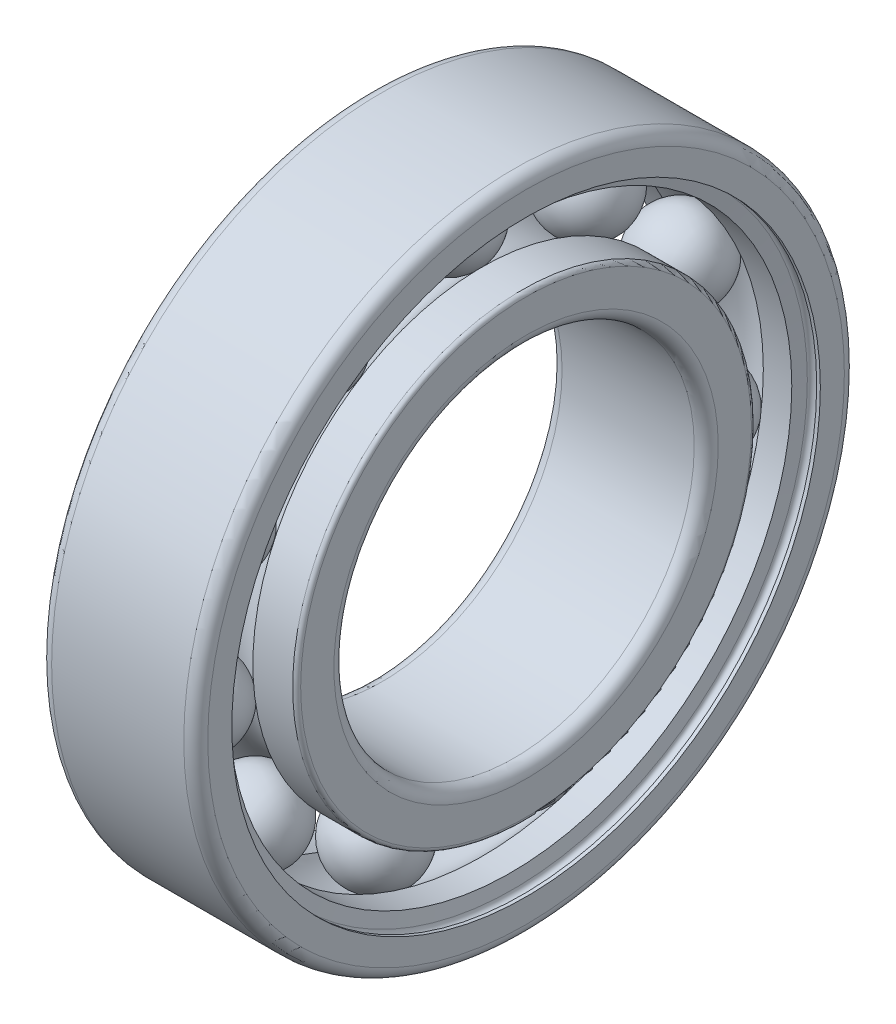
ISO-10303-21;
HEADER;
FILE_DESCRIPTION(('STEP AP214'),'2;1');
FILE_NAME('part.step','',(''),(''),'','','');
FILE_SCHEMA(('AUTOMOTIVE_DESIGN { 1 0 10303 214 1 1 1 1 }'));
ENDSEC;
DATA;
#1=APPLICATION_CONTEXT('core data for automotive mechanical design processes');
#2=APPLICATION_PROTOCOL_DEFINITION('international standard','automotive_design',2000,#1);
#3=PRODUCT_CONTEXT('',#1,'mechanical');
#4=PRODUCT('Part','Part','',(#3));
#5=PRODUCT_RELATED_PRODUCT_CATEGORY('part','',(#4));
#6=PRODUCT_DEFINITION_FORMATION('','',#4);
#7=PRODUCT_DEFINITION_CONTEXT('part definition',#1,'design');
#8=PRODUCT_DEFINITION('design','',#6,#7);
#9=PRODUCT_DEFINITION_SHAPE('','',#8);
#10=(LENGTH_UNIT() NAMED_UNIT(*) SI_UNIT(.MILLI.,.METRE.));
#11=(NAMED_UNIT(*) PLANE_ANGLE_UNIT() SI_UNIT($,.RADIAN.));
#12=(NAMED_UNIT(*) SI_UNIT($,.STERADIAN.) SOLID_ANGLE_UNIT());
#13=UNCERTAINTY_MEASURE_WITH_UNIT(LENGTH_MEASURE(1.E-05),#10,'distance_accuracy_value','');
#14=(GEOMETRIC_REPRESENTATION_CONTEXT(3) GLOBAL_UNCERTAINTY_ASSIGNED_CONTEXT((#13)) GLOBAL_UNIT_ASSIGNED_CONTEXT((#10,
#11,#12)) REPRESENTATION_CONTEXT('',''));
#15=CARTESIAN_POINT('',(0.,0.,0.));
#16=DIRECTION('',(0.,0.,1.));
#17=DIRECTION('',(1.,0.,0.));
#18=AXIS2_PLACEMENT_3D('',#15,#16,#17);
#19=CARTESIAN_POINT('',(0.999999999999225,0.,0.));
#20=DIRECTION('',(1.,0.,0.));
#21=DIRECTION('',(0.,0.,-1.));
#22=AXIS2_PLACEMENT_3D('',#19,#20,#21);
#23=TOROIDAL_SURFACE('',#22,15.9999999999992,0.999999999999224);
#24=CARTESIAN_POINT('',(1.,0.,0.));
#25=DIRECTION('',(1.,0.,0.));
#26=DIRECTION('',(0.,0.,-1.));
#27=AXIS2_PLACEMENT_3D('',#24,#25,#26);
#28=CIRCLE('',#27,15.);
#29=CARTESIAN_POINT('',(1.,0.,-15.));
#30=VERTEX_POINT('',#29);
#31=EDGE_CURVE('P0_E10',#30,#30,#28,.T.);
#32=ORIENTED_EDGE('',*,*,#31,.T.);
#33=EDGE_LOOP('',(#32));
#34=FACE_BOUND('',#33,.T.);
#35=CARTESIAN_POINT('',(0.,0.,0.));
#36=DIRECTION('',(1.,0.,0.));
#37=DIRECTION('',(0.,0.,-1.));
#38=AXIS2_PLACEMENT_3D('',#35,#36,#37);
#39=CIRCLE('',#38,16.);
#40=CARTESIAN_POINT('',(0.,0.,-16.));
#41=VERTEX_POINT('',#40);
#42=EDGE_CURVE('P0_E49',#41,#41,#39,.T.);
#43=ORIENTED_EDGE('',*,*,#42,.F.);
#44=EDGE_LOOP('',(#43));
#45=FACE_BOUND('',#44,.T.);
#46=ADVANCED_FACE('P0_F15',(#34,#45),#23,.T.);
#47=CARTESIAN_POINT('',(12.,0.,0.));
#48=DIRECTION('',(1.,0.,0.));
#49=DIRECTION('',(0.,0.,-1.));
#50=AXIS2_PLACEMENT_3D('',#47,#48,#49);
#51=CYLINDRICAL_SURFACE('',#50,15.);
#52=CARTESIAN_POINT('',(12.,0.,0.));
#53=DIRECTION('',(1.,0.,0.));
#54=DIRECTION('',(0.,0.,-1.));
#55=AXIS2_PLACEMENT_3D('',#52,#53,#54);
#56=CIRCLE('',#55,15.);
#57=CARTESIAN_POINT('',(12.,0.,-15.));
#58=VERTEX_POINT('',#57);
#59=EDGE_CURVE('P0_E21',#58,#58,#56,.T.);
#60=ORIENTED_EDGE('',*,*,#59,.T.);
#61=EDGE_LOOP('',(#60));
#62=FACE_BOUND('',#61,.T.);
#63=ORIENTED_EDGE('',*,*,#31,.F.);
#64=EDGE_LOOP('',(#63));
#65=FACE_BOUND('',#64,.T.);
#66=ADVANCED_FACE('P0_F57',(#62,#65),#51,.F.);
#67=CARTESIAN_POINT('',(12.0000000000015,0.,0.));
#68=DIRECTION('',(1.,0.,0.));
#69=DIRECTION('',(0.,0.,-1.));
#70=AXIS2_PLACEMENT_3D('',#67,#68,#69);
#71=TOROIDAL_SURFACE('',#70,15.9999999999985,0.99999999999846);
#72=CARTESIAN_POINT('',(13.,0.,0.));
#73=DIRECTION('',(1.,0.,0.));
#74=DIRECTION('',(0.,0.,-1.));
#75=AXIS2_PLACEMENT_3D('',#72,#73,#74);
#76=CIRCLE('',#75,16.);
#77=CARTESIAN_POINT('',(13.,0.,-16.));
#78=VERTEX_POINT('',#77);
#79=EDGE_CURVE('P0_E25',#78,#78,#76,.T.);
#80=ORIENTED_EDGE('',*,*,#79,.T.);
#81=EDGE_LOOP('',(#80));
#82=FACE_BOUND('',#81,.T.);
#83=ORIENTED_EDGE('',*,*,#59,.F.);
#84=EDGE_LOOP('',(#83));
#85=FACE_BOUND('',#84,.T.);
#86=ADVANCED_FACE('P0_F62',(#82,#85),#71,.T.);
#87=CARTESIAN_POINT('',(13.,16.,0.));
#88=DIRECTION('',(1.,0.,0.));
#89=DIRECTION('',(0.,0.,-1.));
#90=AXIS2_PLACEMENT_3D('',#87,#88,#89);
#91=PLANE('',#90);
#92=CARTESIAN_POINT('',(13.,0.,0.));
#93=DIRECTION('',(1.,0.,0.));
#94=DIRECTION('',(0.,0.,-1.));
#95=AXIS2_PLACEMENT_3D('',#92,#93,#94);
#96=CIRCLE('',#95,18.767);
#97=CARTESIAN_POINT('',(13.,0.,-18.767));
#98=VERTEX_POINT('',#97);
#99=EDGE_CURVE('P0_E29',#98,#98,#96,.T.);
#100=ORIENTED_EDGE('',*,*,#99,.T.);
#101=EDGE_LOOP('',(#100));
#102=FACE_BOUND('',#101,.T.);
#103=ORIENTED_EDGE('',*,*,#79,.F.);
#104=EDGE_LOOP('',(#103));
#105=FACE_BOUND('',#104,.T.);
#106=ADVANCED_FACE('P0_F66',(#102,#105),#91,.T.);
#107=CARTESIAN_POINT('',(12.6669999999996,0.,0.));
#108=DIRECTION('',(1.,0.,0.));
#109=DIRECTION('',(0.,0.,-1.));
#110=AXIS2_PLACEMENT_3D('',#107,#108,#109);
#111=TOROIDAL_SURFACE('',#110,18.7669999999996,0.33300000000041);
#112=CARTESIAN_POINT('',(12.667,0.,0.));
#113=DIRECTION('',(1.,0.,0.));
#114=DIRECTION('',(0.,0.,-1.));
#115=AXIS2_PLACEMENT_3D('',#112,#113,#114);
#116=CIRCLE('',#115,19.1);
#117=CARTESIAN_POINT('',(12.667,0.,-19.1));
#118=VERTEX_POINT('',#117);
#119=EDGE_CURVE('P0_E34',#118,#118,#116,.T.);
#120=ORIENTED_EDGE('',*,*,#119,.T.);
#121=EDGE_LOOP('',(#120));
#122=FACE_BOUND('',#121,.T.);
#123=ORIENTED_EDGE('',*,*,#99,.F.);
#124=EDGE_LOOP('',(#123));
#125=FACE_BOUND('',#124,.T.);
#126=ADVANCED_FACE('P0_F73',(#122,#125),#111,.T.);
#127=CARTESIAN_POINT('',(12.,0.,0.));
#128=DIRECTION('',(1.,0.,0.));
#129=DIRECTION('',(0.,0.,-1.));
#130=AXIS2_PLACEMENT_3D('',#127,#128,#129);
#131=CYLINDRICAL_SURFACE('',#130,19.1);
#132=CARTESIAN_POINT('',(9.3524873356424,0.,0.));
#133=DIRECTION('',(1.,0.,0.));
#134=DIRECTION('',(0.,0.,-1.));
#135=AXIS2_PLACEMENT_3D('',#132,#133,#134);
#136=CIRCLE('',#135,19.1);
#137=CARTESIAN_POINT('',(9.3524873356424,0.,-19.1));
#138=VERTEX_POINT('',#137);
#139=EDGE_CURVE('P0_E37',#138,#138,#136,.T.);
#140=ORIENTED_EDGE('',*,*,#139,.T.);
#141=EDGE_LOOP('',(#140));
#142=FACE_BOUND('',#141,.T.);
#143=ORIENTED_EDGE('',*,*,#119,.F.);
#144=EDGE_LOOP('',(#143));
#145=FACE_BOUND('',#144,.T.);
#146=ADVANCED_FACE('P0_F77',(#142,#145),#131,.T.);
#147=CARTESIAN_POINT('',(6.5,0.,0.));
#148=DIRECTION('',(1.,0.,0.));
#149=DIRECTION('',(0.,0.,-1.));
#150=AXIS2_PLACEMENT_3D('',#147,#148,#149);
#151=TOROIDAL_SURFACE('',#150,21.2500000000001,3.5720000000001);
#152=CARTESIAN_POINT('',(3.6475126643576,0.,0.));
#153=DIRECTION('',(1.,0.,0.));
#154=DIRECTION('',(0.,0.,-1.));
#155=AXIS2_PLACEMENT_3D('',#152,#153,#154);
#156=CIRCLE('',#155,19.1);
#157=CARTESIAN_POINT('',(3.6475126643576,0.,-19.1));
#158=VERTEX_POINT('',#157);
#159=EDGE_CURVE('P0_E40',#158,#158,#156,.T.);
#160=ORIENTED_EDGE('',*,*,#159,.T.);
#161=EDGE_LOOP('',(#160));
#162=FACE_BOUND('',#161,.T.);
#163=ORIENTED_EDGE('',*,*,#139,.F.);
#164=EDGE_LOOP('',(#163));
#165=FACE_BOUND('',#164,.T.);
#166=ADVANCED_FACE('P0_F81',(#162,#165),#151,.F.);
#167=CARTESIAN_POINT('',(12.,0.,0.));
#168=DIRECTION('',(1.,0.,0.));
#169=DIRECTION('',(0.,0.,-1.));
#170=AXIS2_PLACEMENT_3D('',#167,#168,#169);
#171=CYLINDRICAL_SURFACE('',#170,19.1);
#172=CARTESIAN_POINT('',(0.333,0.,0.));
#173=DIRECTION('',(1.,0.,0.));
#174=DIRECTION('',(0.,0.,-1.));
#175=AXIS2_PLACEMENT_3D('',#172,#173,#174);
#176=CIRCLE('',#175,19.1);
#177=CARTESIAN_POINT('',(0.333,0.,-19.1));
#178=VERTEX_POINT('',#177);
#179=EDGE_CURVE('P0_E43',#178,#178,#176,.T.);
#180=ORIENTED_EDGE('',*,*,#179,.T.);
#181=EDGE_LOOP('',(#180));
#182=FACE_BOUND('',#181,.T.);
#183=ORIENTED_EDGE('',*,*,#159,.F.);
#184=EDGE_LOOP('',(#183));
#185=FACE_BOUND('',#184,.T.);
#186=ADVANCED_FACE('P0_F85',(#182,#185),#171,.T.);
#187=CARTESIAN_POINT('',(0.333000000000206,0.,0.));
#188=DIRECTION('',(1.,0.,0.));
#189=DIRECTION('',(0.,0.,-1.));
#190=AXIS2_PLACEMENT_3D('',#187,#188,#189);
#191=TOROIDAL_SURFACE('',#190,18.7669999999998,0.333000000000205);
#192=CARTESIAN_POINT('',(0.,0.,0.));
#193=DIRECTION('',(1.,0.,0.));
#194=DIRECTION('',(0.,0.,-1.));
#195=AXIS2_PLACEMENT_3D('',#192,#193,#194);
#196=CIRCLE('',#195,18.767);
#197=CARTESIAN_POINT('',(0.,0.,-18.767));
#198=VERTEX_POINT('',#197);
#199=EDGE_CURVE('P0_E46',#198,#198,#196,.T.);
#200=ORIENTED_EDGE('',*,*,#199,.T.);
#201=EDGE_LOOP('',(#200));
#202=FACE_BOUND('',#201,.T.);
#203=ORIENTED_EDGE('',*,*,#179,.F.);
#204=EDGE_LOOP('',(#203));
#205=FACE_BOUND('',#204,.T.);
#206=ADVANCED_FACE('P0_F89',(#202,#205),#191,.T.);
#207=CARTESIAN_POINT('',(0.,18.767,0.));
#208=DIRECTION('',(-1.,0.,0.));
#209=DIRECTION('',(0.,0.,1.));
#210=AXIS2_PLACEMENT_3D('',#207,#208,#209);
#211=PLANE('',#210);
#212=ORIENTED_EDGE('',*,*,#42,.T.);
#213=EDGE_LOOP('',(#212));
#214=FACE_BOUND('',#213,.T.);
#215=ORIENTED_EDGE('',*,*,#199,.F.);
#216=EDGE_LOOP('',(#215));
#217=FACE_BOUND('',#216,.T.);
#218=ADVANCED_FACE('P0_F53',(#214,#217),#211,.T.);
#219=CLOSED_SHELL('',(#46,#66,#86,#106,#126,#146,#166,#186,#206,#218));
#220=MANIFOLD_SOLID_BREP('P0_B1',#219);
#221=CARTESIAN_POINT('',(0.999999999999224,0.,0.));
#222=DIRECTION('',(1.,0.,0.));
#223=DIRECTION('',(0.,0.,-1.));
#224=AXIS2_PLACEMENT_3D('',#221,#222,#223);
#225=TOROIDAL_SURFACE('',#224,26.5000000000008,0.999999999999224);
#226=CARTESIAN_POINT('',(0.,0.,0.));
#227=DIRECTION('',(1.,0.,0.));
#228=DIRECTION('',(0.,0.,-1.));
#229=AXIS2_PLACEMENT_3D('',#226,#227,#228);
#230=CIRCLE('',#229,26.5);
#231=CARTESIAN_POINT('',(0.,0.,-26.5));
#232=VERTEX_POINT('',#231);
#233=EDGE_CURVE('P1_E10',#232,#232,#230,.T.);
#234=ORIENTED_EDGE('',*,*,#233,.T.);
#235=EDGE_LOOP('',(#234));
#236=FACE_BOUND('',#235,.T.);
#237=CARTESIAN_POINT('',(1.,0.,0.));
#238=DIRECTION('',(1.,0.,0.));
#239=DIRECTION('',(0.,0.,-1.));
#240=AXIS2_PLACEMENT_3D('',#237,#238,#239);
#241=CIRCLE('',#240,27.5);
#242=CARTESIAN_POINT('',(1.,0.,-27.5));
#243=VERTEX_POINT('',#242);
#244=EDGE_CURVE('P1_E61',#243,#243,#241,.T.);
#245=ORIENTED_EDGE('',*,*,#244,.F.);
#246=EDGE_LOOP('',(#245));
#247=FACE_BOUND('',#246,.T.);
#248=ADVANCED_FACE('P1_F15',(#236,#247),#225,.T.);
#249=CARTESIAN_POINT('',(0.,26.5,0.));
#250=DIRECTION('',(-1.,0.,0.));
#251=DIRECTION('',(0.,0.,1.));
#252=AXIS2_PLACEMENT_3D('',#249,#250,#251);
#253=PLANE('',#252);
#254=CARTESIAN_POINT('',(0.,0.,0.));
#255=DIRECTION('',(1.,0.,0.));
#256=DIRECTION('',(0.,0.,-1.));
#257=AXIS2_PLACEMENT_3D('',#254,#255,#256);
#258=CIRCLE('',#257,24.5);
#259=CARTESIAN_POINT('',(0.,0.,-24.5));
#260=VERTEX_POINT('',#259);
#261=EDGE_CURVE('P1_E21',#260,#260,#258,.T.);
#262=ORIENTED_EDGE('',*,*,#261,.T.);
#263=EDGE_LOOP('',(#262));
#264=FACE_BOUND('',#263,.T.);
#265=ORIENTED_EDGE('',*,*,#233,.F.);
#266=EDGE_LOOP('',(#265));
#267=FACE_BOUND('',#266,.T.);
#268=ADVANCED_FACE('P1_F69',(#264,#267),#253,.T.);
#269=CARTESIAN_POINT('',(12.,0.,0.));
#270=DIRECTION('',(1.,0.,0.));
#271=DIRECTION('',(0.,0.,-1.));
#272=AXIS2_PLACEMENT_3D('',#269,#270,#271);
#273=CYLINDRICAL_SURFACE('',#272,24.5);
#274=CARTESIAN_POINT('',(0.303333333333331,0.,0.));
#275=DIRECTION('',(1.,0.,0.));
#276=DIRECTION('',(0.,0.,-1.));
#277=AXIS2_PLACEMENT_3D('',#274,#275,#276);
#278=CIRCLE('',#277,24.5);
#279=CARTESIAN_POINT('',(0.303333333333331,0.,-24.5));
#280=VERTEX_POINT('',#279);
#281=EDGE_CURVE('P1_E25',#280,#280,#278,.T.);
#282=ORIENTED_EDGE('',*,*,#281,.T.);
#283=EDGE_LOOP('',(#282));
#284=FACE_BOUND('',#283,.T.);
#285=ORIENTED_EDGE('',*,*,#261,.F.);
#286=EDGE_LOOP('',(#285));
#287=FACE_BOUND('',#286,.T.);
#288=ADVANCED_FACE('P1_F74',(#284,#287),#273,.F.);
#289=CARTESIAN_POINT('',(0.693333333333315,0.,0.));
#290=DIRECTION('',(1.,0.,0.));
#291=DIRECTION('',(0.,0.,-1.));
#292=AXIS2_PLACEMENT_3D('',#289,#290,#291);
#293=TOROIDAL_SURFACE('',#292,24.5,0.389999999999985);
#294=CARTESIAN_POINT('',(1.0833333333333,0.,0.));
#295=DIRECTION('',(1.,0.,0.));
#296=DIRECTION('',(0.,0.,-1.));
#297=AXIS2_PLACEMENT_3D('',#294,#295,#296);
#298=CIRCLE('',#297,24.5);
#299=CARTESIAN_POINT('',(1.0833333333333,0.,-24.5));
#300=VERTEX_POINT('',#299);
#301=EDGE_CURVE('P1_E29',#300,#300,#298,.T.);
#302=ORIENTED_EDGE('',*,*,#301,.T.);
#303=EDGE_LOOP('',(#302));
#304=FACE_BOUND('',#303,.T.);
#305=ORIENTED_EDGE('',*,*,#281,.F.);
#306=EDGE_LOOP('',(#305));
#307=FACE_BOUND('',#306,.T.);
#308=ADVANCED_FACE('P1_F78',(#304,#307),#293,.F.);
#309=CARTESIAN_POINT('',(1.0833333333333,0.,0.));
#310=DIRECTION('',(-1.,0.,0.));
#311=DIRECTION('',(0.,0.,1.));
#312=AXIS2_PLACEMENT_3D('',#309,#310,#311);
#313=CONICAL_SURFACE('',#312,24.5,1.39626340159547);
#314=CARTESIAN_POINT('',(1.2772930121126,0.,0.));
#315=DIRECTION('',(1.,0.,0.));
#316=DIRECTION('',(0.,0.,-1.));
#317=AXIS2_PLACEMENT_3D('',#314,#315,#316);
#318=CIRCLE('',#317,23.4);
#319=CARTESIAN_POINT('',(1.2772930121126,0.,-23.4));
#320=VERTEX_POINT('',#319);
#321=EDGE_CURVE('P1_E34',#320,#320,#318,.T.);
#322=ORIENTED_EDGE('',*,*,#321,.T.);
#323=EDGE_LOOP('',(#322));
#324=FACE_BOUND('',#323,.T.);
#325=ORIENTED_EDGE('',*,*,#301,.F.);
#326=EDGE_LOOP('',(#325));
#327=FACE_BOUND('',#326,.T.);
#328=ADVANCED_FACE('P1_F85',(#324,#327),#313,.F.);
#329=CARTESIAN_POINT('',(12.,0.,0.));
#330=DIRECTION('',(1.,0.,0.));
#331=DIRECTION('',(0.,0.,-1.));
#332=AXIS2_PLACEMENT_3D('',#329,#330,#331);
#333=CYLINDRICAL_SURFACE('',#332,23.4);
#334=CARTESIAN_POINT('',(3.6475126643576,0.,0.));
#335=DIRECTION('',(1.,0.,0.));
#336=DIRECTION('',(0.,0.,-1.));
#337=AXIS2_PLACEMENT_3D('',#334,#335,#336);
#338=CIRCLE('',#337,23.4);
#339=CARTESIAN_POINT('',(3.6475126643576,0.,-23.4));
#340=VERTEX_POINT('',#339);
#341=EDGE_CURVE('P1_E37',#340,#340,#338,.T.);
#342=ORIENTED_EDGE('',*,*,#341,.T.);
#343=EDGE_LOOP('',(#342));
#344=FACE_BOUND('',#343,.T.);
#345=ORIENTED_EDGE('',*,*,#321,.F.);
#346=EDGE_LOOP('',(#345));
#347=FACE_BOUND('',#346,.T.);
#348=ADVANCED_FACE('P1_F89',(#344,#347),#333,.F.);
#349=CARTESIAN_POINT('',(6.49999999999995,0.,0.));
#350=DIRECTION('',(1.,0.,0.));
#351=DIRECTION('',(0.,0.,-1.));
#352=AXIS2_PLACEMENT_3D('',#349,#350,#351);
#353=TOROIDAL_SURFACE('',#352,21.25,3.572);
#354=CARTESIAN_POINT('',(9.3524873356423,0.,0.));
#355=DIRECTION('',(1.,0.,0.));
#356=DIRECTION('',(0.,0.,-1.));
#357=AXIS2_PLACEMENT_3D('',#354,#355,#356);
#358=CIRCLE('',#357,23.4);
#359=CARTESIAN_POINT('',(9.3524873356423,0.,-23.4));
#360=VERTEX_POINT('',#359);
#361=EDGE_CURVE('P1_E40',#360,#360,#358,.T.);
#362=ORIENTED_EDGE('',*,*,#361,.T.);
#363=EDGE_LOOP('',(#362));
#364=FACE_BOUND('',#363,.T.);
#365=ORIENTED_EDGE('',*,*,#341,.F.);
#366=EDGE_LOOP('',(#365));
#367=FACE_BOUND('',#366,.T.);
#368=ADVANCED_FACE('P1_F93',(#364,#367),#353,.F.);
#369=CARTESIAN_POINT('',(12.,0.,0.));
#370=DIRECTION('',(1.,0.,0.));
#371=DIRECTION('',(0.,0.,-1.));
#372=AXIS2_PLACEMENT_3D('',#369,#370,#371);
#373=CYLINDRICAL_SURFACE('',#372,23.4);
#374=CARTESIAN_POINT('',(11.722706987887,0.,0.));
#375=DIRECTION('',(1.,0.,0.));
#376=DIRECTION('',(0.,0.,-1.));
#377=AXIS2_PLACEMENT_3D('',#374,#375,#376);
#378=CIRCLE('',#377,23.4);
#379=CARTESIAN_POINT('',(11.722706987887,0.,-23.4));
#380=VERTEX_POINT('',#379);
#381=EDGE_CURVE('P1_E43',#380,#380,#378,.T.);
#382=ORIENTED_EDGE('',*,*,#381,.T.);
#383=EDGE_LOOP('',(#382));
#384=FACE_BOUND('',#383,.T.);
#385=ORIENTED_EDGE('',*,*,#361,.F.);
#386=EDGE_LOOP('',(#385));
#387=FACE_BOUND('',#386,.T.);
#388=ADVANCED_FACE('P1_F97',(#384,#387),#373,.F.);
#389=CARTESIAN_POINT('',(11.722706987887,0.,0.));
#390=DIRECTION('',(1.,0.,0.));
#391=DIRECTION('',(0.,0.,-1.));
#392=AXIS2_PLACEMENT_3D('',#389,#390,#391);
#393=CONICAL_SURFACE('',#392,23.4,1.39626340159486);
#394=CARTESIAN_POINT('',(11.916666666667,0.,0.));
#395=DIRECTION('',(1.,0.,0.));
#396=DIRECTION('',(0.,0.,-1.));
#397=AXIS2_PLACEMENT_3D('',#394,#395,#396);
#398=CIRCLE('',#397,24.5);
#399=CARTESIAN_POINT('',(11.916666666667,0.,-24.5));
#400=VERTEX_POINT('',#399);
#401=EDGE_CURVE('P1_E46',#400,#400,#398,.T.);
#402=ORIENTED_EDGE('',*,*,#401,.T.);
#403=EDGE_LOOP('',(#402));
#404=FACE_BOUND('',#403,.T.);
#405=ORIENTED_EDGE('',*,*,#381,.F.);
#406=EDGE_LOOP('',(#405));
#407=FACE_BOUND('',#406,.T.);
#408=ADVANCED_FACE('P1_F101',(#404,#407),#393,.F.);
#409=CARTESIAN_POINT('',(12.306666666667,0.,0.));
#410=DIRECTION('',(1.,0.,0.));
#411=DIRECTION('',(0.,0.,-1.));
#412=AXIS2_PLACEMENT_3D('',#409,#410,#411);
#413=TOROIDAL_SURFACE('',#412,24.5,0.39);
#414=CARTESIAN_POINT('',(12.696666666667,0.,0.));
#415=DIRECTION('',(1.,0.,0.));
#416=DIRECTION('',(0.,0.,-1.));
#417=AXIS2_PLACEMENT_3D('',#414,#415,#416);
#418=CIRCLE('',#417,24.5);
#419=CARTESIAN_POINT('',(12.696666666667,0.,-24.5));
#420=VERTEX_POINT('',#419);
#421=EDGE_CURVE('P1_E49',#420,#420,#418,.T.);
#422=ORIENTED_EDGE('',*,*,#421,.T.);
#423=EDGE_LOOP('',(#422));
#424=FACE_BOUND('',#423,.T.);
#425=ORIENTED_EDGE('',*,*,#401,.F.);
#426=EDGE_LOOP('',(#425));
#427=FACE_BOUND('',#426,.T.);
#428=ADVANCED_FACE('P1_F105',(#424,#427),#413,.F.);
#429=CARTESIAN_POINT('',(12.,0.,0.));
#430=DIRECTION('',(1.,0.,0.));
#431=DIRECTION('',(0.,0.,-1.));
#432=AXIS2_PLACEMENT_3D('',#429,#430,#431);
#433=CYLINDRICAL_SURFACE('',#432,24.5);
#434=CARTESIAN_POINT('',(13.,0.,0.));
#435=DIRECTION('',(1.,0.,0.));
#436=DIRECTION('',(0.,0.,-1.));
#437=AXIS2_PLACEMENT_3D('',#434,#435,#436);
#438=CIRCLE('',#437,24.5);
#439=CARTESIAN_POINT('',(13.,0.,-24.5));
#440=VERTEX_POINT('',#439);
#441=EDGE_CURVE('P1_E52',#440,#440,#438,.T.);
#442=ORIENTED_EDGE('',*,*,#441,.T.);
#443=EDGE_LOOP('',(#442));
#444=FACE_BOUND('',#443,.T.);
#445=ORIENTED_EDGE('',*,*,#421,.F.);
#446=EDGE_LOOP('',(#445));
#447=FACE_BOUND('',#446,.T.);
#448=ADVANCED_FACE('P1_F109',(#444,#447),#433,.F.);
#449=CARTESIAN_POINT('',(13.,24.5,0.));
#450=DIRECTION('',(1.,0.,0.));
#451=DIRECTION('',(0.,0.,-1.));
#452=AXIS2_PLACEMENT_3D('',#449,#450,#451);
#453=PLANE('',#452);
#454=CARTESIAN_POINT('',(13.,0.,0.));
#455=DIRECTION('',(1.,0.,0.));
#456=DIRECTION('',(0.,0.,-1.));
#457=AXIS2_PLACEMENT_3D('',#454,#455,#456);
#458=CIRCLE('',#457,26.5);
#459=CARTESIAN_POINT('',(13.,0.,-26.5));
#460=VERTEX_POINT('',#459);
#461=EDGE_CURVE('P1_E55',#460,#460,#458,.T.);
#462=ORIENTED_EDGE('',*,*,#461,.T.);
#463=EDGE_LOOP('',(#462));
#464=FACE_BOUND('',#463,.T.);
#465=ORIENTED_EDGE('',*,*,#441,.F.);
#466=EDGE_LOOP('',(#465));
#467=FACE_BOUND('',#466,.T.);
#468=ADVANCED_FACE('P1_F113',(#464,#467),#453,.T.);
#469=CARTESIAN_POINT('',(12.0000000000015,0.,0.));
#470=DIRECTION('',(1.,0.,0.));
#471=DIRECTION('',(0.,0.,-1.));
#472=AXIS2_PLACEMENT_3D('',#469,#470,#471);
#473=TOROIDAL_SURFACE('',#472,26.5000000000015,0.999999999998458);
#474=CARTESIAN_POINT('',(12.,0.,0.));
#475=DIRECTION('',(1.,0.,0.));
#476=DIRECTION('',(0.,0.,-1.));
#477=AXIS2_PLACEMENT_3D('',#474,#475,#476);
#478=CIRCLE('',#477,27.5);
#479=CARTESIAN_POINT('',(12.,0.,-27.5));
#480=VERTEX_POINT('',#479);
#481=EDGE_CURVE('P1_E58',#480,#480,#478,.T.);
#482=ORIENTED_EDGE('',*,*,#481,.T.);
#483=EDGE_LOOP('',(#482));
#484=FACE_BOUND('',#483,.T.);
#485=ORIENTED_EDGE('',*,*,#461,.F.);
#486=EDGE_LOOP('',(#485));
#487=FACE_BOUND('',#486,.T.);
#488=ADVANCED_FACE('P1_F117',(#484,#487),#473,.T.);
#489=CARTESIAN_POINT('',(12.,0.,0.));
#490=DIRECTION('',(1.,0.,0.));
#491=DIRECTION('',(0.,0.,-1.));
#492=AXIS2_PLACEMENT_3D('',#489,#490,#491);
#493=CYLINDRICAL_SURFACE('',#492,27.5);
#494=ORIENTED_EDGE('',*,*,#244,.T.);
#495=EDGE_LOOP('',(#494));
#496=FACE_BOUND('',#495,.T.);
#497=ORIENTED_EDGE('',*,*,#481,.F.);
#498=EDGE_LOOP('',(#497));
#499=FACE_BOUND('',#498,.T.);
#500=ADVANCED_FACE('P1_F65',(#496,#499),#493,.T.);
#501=CLOSED_SHELL('',(#248,#268,#288,#308,#328,#348,#368,#388,#408,#428,#448,#468,#488,#500));
#502=MANIFOLD_SOLID_BREP('P1_B1',#501);
#503=CARTESIAN_POINT('',(6.5,21.25,0.));
#504=DIRECTION('',(1.,0.,0.));
#505=DIRECTION('',(0.,1.,0.));
#506=AXIS2_PLACEMENT_3D('',#503,#504,#505);
#507=SPHERICAL_SURFACE('',#506,3.572);
#508=CARTESIAN_POINT('',(10.072,21.25,0.));
#509=VERTEX_POINT('',#508);
#510=VERTEX_LOOP('',#509);
#511=FACE_BOUND('',#510,.T.);
#512=ADVANCED_FACE('P2_F12',(#511),#507,.T.);
#513=CLOSED_SHELL('',(#512));
#514=MANIFOLD_SOLID_BREP('P2_B1',#513);
#515=CARTESIAN_POINT('',(6.5,8.82756902629013,19.3296799012835));
#516=DIRECTION('',(1.,0.,0.));
#517=DIRECTION('',(0.,0.415415013001889,0.909631995354517));
#518=AXIS2_PLACEMENT_3D('',#515,#516,#517);
#519=SPHERICAL_SURFACE('',#518,3.572);
#520=CARTESIAN_POINT('',(10.072,8.82756902629013,19.3296799012835));
#521=VERTEX_POINT('',#520);
#522=VERTEX_LOOP('',#521);
#523=FACE_BOUND('',#522,.T.);
#524=ADVANCED_FACE('P3_F12',(#523),#519,.T.);
#525=CLOSED_SHELL('',(#524));
#526=MANIFOLD_SOLID_BREP('P3_B1',#525);
#527=CARTESIAN_POINT('',(6.5,17.8766375726626,11.4886173709315));
#528=DIRECTION('',(1.,0.,0.));
#529=DIRECTION('',(0.,0.84125353283118,0.5406408174556));
#530=AXIS2_PLACEMENT_3D('',#527,#528,#529);
#531=SPHERICAL_SURFACE('',#530,3.572);
#532=CARTESIAN_POINT('',(10.072,17.8766375726626,11.4886173709315));
#533=VERTEX_POINT('',#532);
#534=VERTEX_LOOP('',#533);
#535=FACE_BOUND('',#534,.T.);
#536=ADVANCED_FACE('P4_F12',(#535),#531,.T.);
#537=CLOSED_SHELL('',(#536));
#538=MANIFOLD_SOLID_BREP('P4_B1',#537);
#539=CARTESIAN_POINT('',(6.5,17.8766375726626,-11.4886173709315));
#540=DIRECTION('',(1.,0.,0.));
#541=DIRECTION('',(0.,0.84125353283118,-0.5406408174556));
#542=AXIS2_PLACEMENT_3D('',#539,#540,#541);
#543=SPHERICAL_SURFACE('',#542,3.572);
#544=CARTESIAN_POINT('',(10.072,17.8766375726626,-11.4886173709315));
#545=VERTEX_POINT('',#544);
#546=VERTEX_LOOP('',#545);
#547=FACE_BOUND('',#546,.T.);
#548=ADVANCED_FACE('P5_F12',(#547),#543,.T.);
#549=CLOSED_SHELL('',(#548));
#550=MANIFOLD_SOLID_BREP('P5_B1',#549);
#551=CARTESIAN_POINT('',(6.5,8.82756902629013,-19.3296799012835));
#552=DIRECTION('',(1.,0.,0.));
#553=DIRECTION('',(0.,0.415415013001889,-0.909631995354517));
#554=AXIS2_PLACEMENT_3D('',#551,#552,#553);
#555=SPHERICAL_SURFACE('',#554,3.572);
#556=CARTESIAN_POINT('',(10.072,8.82756902629013,-19.3296799012835));
#557=VERTEX_POINT('',#556);
#558=VERTEX_LOOP('',#557);
#559=FACE_BOUND('',#558,.T.);
#560=ADVANCED_FACE('P6_F12',(#559),#555,.T.);
#561=CLOSED_SHELL('',(#560));
#562=MANIFOLD_SOLID_BREP('P6_B1',#561);
#563=CARTESIAN_POINT('',(6.5,-3.02419031330742,-21.0337056399698));
#564=DIRECTION('',(1.,0.,0.));
#565=DIRECTION('',(0.,-0.14231483827329,-0.989821441880932));
#566=AXIS2_PLACEMENT_3D('',#563,#564,#565);
#567=SPHERICAL_SURFACE('',#566,3.572);
#568=CARTESIAN_POINT('',(10.072,-3.02419031330742,-21.0337056399698));
#569=VERTEX_POINT('',#568);
#570=VERTEX_LOOP('',#569);
#571=FACE_BOUND('',#570,.T.);
#572=ADVANCED_FACE('P7_F13',(#571),#567,.T.);
#573=CLOSED_SHELL('',(#572));
#574=MANIFOLD_SOLID_BREP('P7_B1',#573);
#575=CARTESIAN_POINT('',(6.5,-13.9157905963372,-16.0596784550281));
#576=DIRECTION('',(1.,0.,0.));
#577=DIRECTION('',(0.,-0.654860733945281,-0.755749574354262));
#578=AXIS2_PLACEMENT_3D('',#575,#576,#577);
#579=SPHERICAL_SURFACE('',#578,3.572);
#580=CARTESIAN_POINT('',(10.072,-13.9157905963372,-16.0596784550281));
#581=VERTEX_POINT('',#580);
#582=VERTEX_LOOP('',#581);
#583=FACE_BOUND('',#582,.T.);
#584=ADVANCED_FACE('P8_F13',(#583),#579,.T.);
#585=CLOSED_SHELL('',(#584));
#586=MANIFOLD_SOLID_BREP('P8_B1',#585);
#587=CARTESIAN_POINT('',(6.5,-20.3892256893081,-5.98681683288037));
#588=DIRECTION('',(1.,0.,0.));
#589=DIRECTION('',(0.,-0.959492973614497,-0.281732556841429));
#590=AXIS2_PLACEMENT_3D('',#587,#588,#589);
#591=SPHERICAL_SURFACE('',#590,3.572);
#592=CARTESIAN_POINT('',(10.072,-20.3892256893081,-5.98681683288037));
#593=VERTEX_POINT('',#592);
#594=VERTEX_LOOP('',#593);
#595=FACE_BOUND('',#594,.T.);
#596=ADVANCED_FACE('P9_F13',(#595),#591,.T.);
#597=CLOSED_SHELL('',(#596));
#598=MANIFOLD_SOLID_BREP('P9_B1',#597);
#599=CARTESIAN_POINT('',(6.5,-20.3892256893081,5.98681683288037));
#600=DIRECTION('',(1.,0.,0.));
#601=DIRECTION('',(0.,-0.959492973614497,0.281732556841429));
#602=AXIS2_PLACEMENT_3D('',#599,#600,#601);
#603=SPHERICAL_SURFACE('',#602,3.572);
#604=CARTESIAN_POINT('',(10.072,-20.3892256893081,5.98681683288037));
#605=VERTEX_POINT('',#604);
#606=VERTEX_LOOP('',#605);
#607=FACE_BOUND('',#606,.T.);
#608=ADVANCED_FACE('P10_F13',(#607),#603,.T.);
#609=CLOSED_SHELL('',(#608));
#610=MANIFOLD_SOLID_BREP('P10_B1',#609);
#611=CARTESIAN_POINT('',(6.5,-13.9157905963373,16.0596784550279));
#612=DIRECTION('',(1.,0.,0.));
#613=DIRECTION('',(0.,-0.654860733945287,0.755749574354257));
#614=AXIS2_PLACEMENT_3D('',#611,#612,#613);
#615=SPHERICAL_SURFACE('',#614,3.572);
#616=CARTESIAN_POINT('',(10.072,-13.9157905963373,16.0596784550279));
#617=VERTEX_POINT('',#616);
#618=VERTEX_LOOP('',#617);
#619=FACE_BOUND('',#618,.T.);
#620=ADVANCED_FACE('P11_F13',(#619),#615,.T.);
#621=CLOSED_SHELL('',(#620));
#622=MANIFOLD_SOLID_BREP('P11_B1',#621);
#623=CARTESIAN_POINT('',(6.5,-3.02419031330742,21.0337056399698));
#624=DIRECTION('',(1.,0.,0.));
#625=DIRECTION('',(0.,-0.14231483827329,0.989821441880932));
#626=AXIS2_PLACEMENT_3D('',#623,#624,#625);
#627=SPHERICAL_SURFACE('',#626,3.572);
#628=CARTESIAN_POINT('',(10.072,-3.02419031330742,21.0337056399698));
#629=VERTEX_POINT('',#628);
#630=VERTEX_LOOP('',#629);
#631=FACE_BOUND('',#630,.T.);
#632=ADVANCED_FACE('P12_F13',(#631),#627,.T.);
#633=CLOSED_SHELL('',(#632));
#634=MANIFOLD_SOLID_BREP('P12_B1',#633);
#635=ADVANCED_BREP_SHAPE_REPRESENTATION('',(#18,#220,#502,#514,#526,#538,#550,#562,#574,#586,
#598,#610,#622,#634),#14);
#636=SHAPE_DEFINITION_REPRESENTATION(#9,#635);
ENDSEC;
END-ISO-10303-21;
